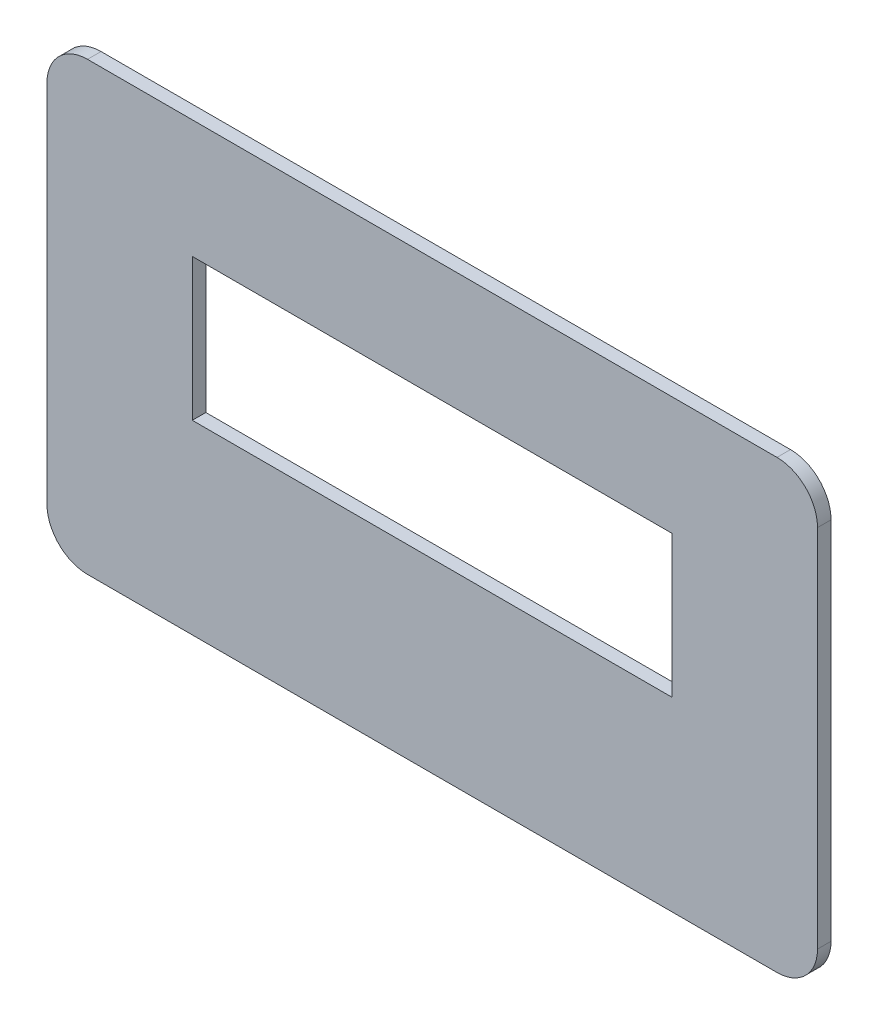
ISO-10303-21;
HEADER;
FILE_DESCRIPTION(('STEP AP214'),'2;1');
FILE_NAME('part.step','',(''),(''),'','','');
FILE_SCHEMA(('AUTOMOTIVE_DESIGN { 1 0 10303 214 1 1 1 1 }'));
ENDSEC;
DATA;
#1=APPLICATION_CONTEXT('core data for automotive mechanical design processes');
#2=APPLICATION_PROTOCOL_DEFINITION('international standard','automotive_design',2000,#1);
#3=PRODUCT_CONTEXT('',#1,'mechanical');
#4=PRODUCT('Part','Part','',(#3));
#5=PRODUCT_RELATED_PRODUCT_CATEGORY('part','',(#4));
#6=PRODUCT_DEFINITION_FORMATION('','',#4);
#7=PRODUCT_DEFINITION_CONTEXT('part definition',#1,'design');
#8=PRODUCT_DEFINITION('design','',#6,#7);
#9=PRODUCT_DEFINITION_SHAPE('','',#8);
#10=(LENGTH_UNIT() NAMED_UNIT(*) SI_UNIT(.MILLI.,.METRE.));
#11=(NAMED_UNIT(*) PLANE_ANGLE_UNIT() SI_UNIT($,.RADIAN.));
#12=(NAMED_UNIT(*) SI_UNIT($,.STERADIAN.) SOLID_ANGLE_UNIT());
#13=UNCERTAINTY_MEASURE_WITH_UNIT(LENGTH_MEASURE(1.E-05),#10,'distance_accuracy_value','');
#14=(GEOMETRIC_REPRESENTATION_CONTEXT(3) GLOBAL_UNCERTAINTY_ASSIGNED_CONTEXT((#13)) GLOBAL_UNIT_ASSIGNED_CONTEXT((#10,
#11,#12)) REPRESENTATION_CONTEXT('',''));
#15=CARTESIAN_POINT('',(0.,0.,0.));
#16=DIRECTION('',(0.,0.,1.));
#17=DIRECTION('',(1.,0.,0.));
#18=AXIS2_PLACEMENT_3D('',#15,#16,#17);
#19=CARTESIAN_POINT('',(-51.,-27.,2.));
#20=DIRECTION('',(0.,0.,-1.));
#21=DIRECTION('',(-1.,0.,0.));
#22=AXIS2_PLACEMENT_3D('',#19,#20,#21);
#23=PLANE('',#22);
#24=CARTESIAN_POINT('',(-51.,-27.,2.));
#25=DIRECTION('',(0.,0.,1.));
#26=DIRECTION('',(-1.,0.,0.));
#27=AXIS2_PLACEMENT_3D('',#24,#25,#26);
#28=CIRCLE('',#27,5.99999999999999);
#29=CARTESIAN_POINT('',(-57.,-27.,2.));
#30=VERTEX_POINT('',#29);
#31=CARTESIAN_POINT('',(-51.,-33.,2.));
#32=VERTEX_POINT('',#31);
#33=EDGE_CURVE('E158',#30,#32,#28,.T.);
#34=ORIENTED_EDGE('',*,*,#33,.T.);
#35=DIRECTION('',(1.,0.,0.));
#36=VECTOR('',#35,1.);
#37=CARTESIAN_POINT('',(51.,-33.,2.));
#38=LINE('',#37,#36);
#39=CARTESIAN_POINT('',(51.,-33.,2.));
#40=VERTEX_POINT('',#39);
#41=EDGE_CURVE('E161',#32,#40,#38,.T.);
#42=ORIENTED_EDGE('',*,*,#41,.T.);
#43=CARTESIAN_POINT('',(51.,-27.,2.));
#44=DIRECTION('',(0.,0.,1.));
#45=DIRECTION('',(1.,0.,0.));
#46=AXIS2_PLACEMENT_3D('',#43,#44,#45);
#47=CIRCLE('',#46,6.);
#48=CARTESIAN_POINT('',(57.,-27.,2.));
#49=VERTEX_POINT('',#48);
#50=EDGE_CURVE('E164',#40,#49,#47,.T.);
#51=ORIENTED_EDGE('',*,*,#50,.T.);
#52=DIRECTION('',(0.,1.,0.));
#53=VECTOR('',#52,1.);
#54=CARTESIAN_POINT('',(57.,27.,2.));
#55=LINE('',#54,#53);
#56=CARTESIAN_POINT('',(57.,27.,2.));
#57=VERTEX_POINT('',#56);
#58=EDGE_CURVE('E166',#49,#57,#55,.T.);
#59=ORIENTED_EDGE('',*,*,#58,.T.);
#60=CARTESIAN_POINT('',(51.,27.,2.));
#61=DIRECTION('',(0.,0.,1.));
#62=DIRECTION('',(1.,0.,0.));
#63=AXIS2_PLACEMENT_3D('',#60,#61,#62);
#64=CIRCLE('',#63,6.);
#65=CARTESIAN_POINT('',(51.,33.,2.));
#66=VERTEX_POINT('',#65);
#67=EDGE_CURVE('E168',#57,#66,#64,.T.);
#68=ORIENTED_EDGE('',*,*,#67,.T.);
#69=DIRECTION('',(-1.,0.,0.));
#70=VECTOR('',#69,1.);
#71=CARTESIAN_POINT('',(51.,33.,2.));
#72=LINE('',#71,#70);
#73=CARTESIAN_POINT('',(-51.,33.,2.));
#74=VERTEX_POINT('',#73);
#75=EDGE_CURVE('E170',#66,#74,#72,.T.);
#76=ORIENTED_EDGE('',*,*,#75,.T.);
#77=CARTESIAN_POINT('',(-51.,27.,2.));
#78=DIRECTION('',(0.,0.,1.));
#79=DIRECTION('',(-1.,0.,0.));
#80=AXIS2_PLACEMENT_3D('',#77,#78,#79);
#81=CIRCLE('',#80,5.99999999999999);
#82=CARTESIAN_POINT('',(-57.,27.,2.));
#83=VERTEX_POINT('',#82);
#84=EDGE_CURVE('E172',#74,#83,#81,.T.);
#85=ORIENTED_EDGE('',*,*,#84,.T.);
#86=DIRECTION('',(0.,-1.,0.));
#87=VECTOR('',#86,1.);
#88=CARTESIAN_POINT('',(-57.,27.,2.));
#89=LINE('',#88,#87);
#90=EDGE_CURVE('E174',#83,#30,#89,.T.);
#91=ORIENTED_EDGE('',*,*,#90,.T.);
#92=EDGE_LOOP('',(#34,#42,#51,#59,#68,#76,#85,#91));
#93=FACE_BOUND('',#92,.T.);
#94=DIRECTION('',(0.,1.,0.));
#95=VECTOR('',#94,1.);
#96=CARTESIAN_POINT('',(35.5,-5.5,2.));
#97=LINE('',#96,#95);
#98=CARTESIAN_POINT('',(35.5,-5.5,2.));
#99=VERTEX_POINT('',#98);
#100=CARTESIAN_POINT('',(35.5,15.5,2.));
#101=VERTEX_POINT('',#100);
#102=EDGE_CURVE('E122',#99,#101,#97,.T.);
#103=ORIENTED_EDGE('',*,*,#102,.F.);
#104=DIRECTION('',(1.,0.,0.));
#105=VECTOR('',#104,1.);
#106=CARTESIAN_POINT('',(-35.5,-5.5,2.));
#107=LINE('',#106,#105);
#108=CARTESIAN_POINT('',(-35.5,-5.5,2.));
#109=VERTEX_POINT('',#108);
#110=EDGE_CURVE('E144',#109,#99,#107,.T.);
#111=ORIENTED_EDGE('',*,*,#110,.F.);
#112=DIRECTION('',(0.,-1.,0.));
#113=VECTOR('',#112,1.);
#114=CARTESIAN_POINT('',(-35.5,-5.5,2.));
#115=LINE('',#114,#113);
#116=CARTESIAN_POINT('',(-35.5,15.5,2.));
#117=VERTEX_POINT('',#116);
#118=EDGE_CURVE('E142',#117,#109,#115,.T.);
#119=ORIENTED_EDGE('',*,*,#118,.F.);
#120=DIRECTION('',(-1.,0.,0.));
#121=VECTOR('',#120,1.);
#122=CARTESIAN_POINT('',(-35.5,15.5,2.));
#123=LINE('',#122,#121);
#124=EDGE_CURVE('E130',#101,#117,#123,.T.);
#125=ORIENTED_EDGE('',*,*,#124,.F.);
#126=EDGE_LOOP('',(#103,#111,#119,#125));
#127=FACE_BOUND('',#126,.T.);
#128=ADVANCED_FACE('F33',(#93,#127),#23,.F.);
#129=CARTESIAN_POINT('',(-51.,-27.,0.));
#130=DIRECTION('',(0.,0.,-1.));
#131=DIRECTION('',(-1.,0.,0.));
#132=AXIS2_PLACEMENT_3D('',#129,#130,#131);
#133=PLANE('',#132);
#134=CARTESIAN_POINT('',(-51.,-27.,0.));
#135=DIRECTION('',(0.,0.,1.));
#136=DIRECTION('',(-1.,0.,0.));
#137=AXIS2_PLACEMENT_3D('',#134,#135,#136);
#138=CIRCLE('',#137,5.99999999999999);
#139=CARTESIAN_POINT('',(-57.,-27.,0.));
#140=VERTEX_POINT('',#139);
#141=CARTESIAN_POINT('',(-51.,-33.,0.));
#142=VERTEX_POINT('',#141);
#143=EDGE_CURVE('E138',#140,#142,#138,.T.);
#144=ORIENTED_EDGE('',*,*,#143,.F.);
#145=DIRECTION('',(0.,-1.,0.));
#146=VECTOR('',#145,1.);
#147=CARTESIAN_POINT('',(-57.,27.,0.));
#148=LINE('',#147,#146);
#149=CARTESIAN_POINT('',(-57.,27.,0.));
#150=VERTEX_POINT('',#149);
#151=EDGE_CURVE('E162',#150,#140,#148,.T.);
#152=ORIENTED_EDGE('',*,*,#151,.F.);
#153=CARTESIAN_POINT('',(-51.,27.,0.));
#154=DIRECTION('',(0.,0.,1.));
#155=DIRECTION('',(-1.,0.,0.));
#156=AXIS2_PLACEMENT_3D('',#153,#154,#155);
#157=CIRCLE('',#156,5.99999999999999);
#158=CARTESIAN_POINT('',(-51.,33.,0.));
#159=VERTEX_POINT('',#158);
#160=EDGE_CURVE('E189',#159,#150,#157,.T.);
#161=ORIENTED_EDGE('',*,*,#160,.F.);
#162=DIRECTION('',(-1.,0.,0.));
#163=VECTOR('',#162,1.);
#164=CARTESIAN_POINT('',(51.,33.,0.));
#165=LINE('',#164,#163);
#166=CARTESIAN_POINT('',(51.,33.,0.));
#167=VERTEX_POINT('',#166);
#168=EDGE_CURVE('E187',#167,#159,#165,.T.);
#169=ORIENTED_EDGE('',*,*,#168,.F.);
#170=CARTESIAN_POINT('',(51.,27.,0.));
#171=DIRECTION('',(0.,0.,1.));
#172=DIRECTION('',(1.,0.,0.));
#173=AXIS2_PLACEMENT_3D('',#170,#171,#172);
#174=CIRCLE('',#173,6.);
#175=CARTESIAN_POINT('',(57.,27.,0.));
#176=VERTEX_POINT('',#175);
#177=EDGE_CURVE('E185',#176,#167,#174,.T.);
#178=ORIENTED_EDGE('',*,*,#177,.F.);
#179=DIRECTION('',(0.,1.,0.));
#180=VECTOR('',#179,1.);
#181=CARTESIAN_POINT('',(57.,27.,0.));
#182=LINE('',#181,#180);
#183=CARTESIAN_POINT('',(57.,-27.,0.));
#184=VERTEX_POINT('',#183);
#185=EDGE_CURVE('E183',#184,#176,#182,.T.);
#186=ORIENTED_EDGE('',*,*,#185,.F.);
#187=CARTESIAN_POINT('',(51.,-27.,0.));
#188=DIRECTION('',(0.,0.,1.));
#189=DIRECTION('',(1.,0.,0.));
#190=AXIS2_PLACEMENT_3D('',#187,#188,#189);
#191=CIRCLE('',#190,6.);
#192=CARTESIAN_POINT('',(51.,-33.,0.));
#193=VERTEX_POINT('',#192);
#194=EDGE_CURVE('E181',#193,#184,#191,.T.);
#195=ORIENTED_EDGE('',*,*,#194,.F.);
#196=DIRECTION('',(1.,0.,0.));
#197=VECTOR('',#196,1.);
#198=CARTESIAN_POINT('',(51.,-33.,0.));
#199=LINE('',#198,#197);
#200=EDGE_CURVE('E179',#142,#193,#199,.T.);
#201=ORIENTED_EDGE('',*,*,#200,.F.);
#202=EDGE_LOOP('',(#144,#152,#161,#169,#178,#186,#195,#201));
#203=FACE_BOUND('',#202,.T.);
#204=DIRECTION('',(1.,0.,0.));
#205=VECTOR('',#204,1.);
#206=CARTESIAN_POINT('',(-35.5,-5.5,0.));
#207=LINE('',#206,#205);
#208=CARTESIAN_POINT('',(-35.5,-5.5,0.));
#209=VERTEX_POINT('',#208);
#210=CARTESIAN_POINT('',(35.5,-5.5,0.));
#211=VERTEX_POINT('',#210);
#212=EDGE_CURVE('E131',#209,#211,#207,.T.);
#213=ORIENTED_EDGE('',*,*,#212,.T.);
#214=DIRECTION('',(0.,1.,0.));
#215=VECTOR('',#214,1.);
#216=CARTESIAN_POINT('',(35.5,-5.5,0.));
#217=LINE('',#216,#215);
#218=CARTESIAN_POINT('',(35.5,15.5,0.));
#219=VERTEX_POINT('',#218);
#220=EDGE_CURVE('E56',#211,#219,#217,.T.);
#221=ORIENTED_EDGE('',*,*,#220,.T.);
#222=DIRECTION('',(-1.,0.,0.));
#223=VECTOR('',#222,1.);
#224=CARTESIAN_POINT('',(-35.5,15.5,0.));
#225=LINE('',#224,#223);
#226=CARTESIAN_POINT('',(-35.5,15.5,0.));
#227=VERTEX_POINT('',#226);
#228=EDGE_CURVE('E137',#219,#227,#225,.T.);
#229=ORIENTED_EDGE('',*,*,#228,.T.);
#230=DIRECTION('',(0.,-1.,0.));
#231=VECTOR('',#230,1.);
#232=CARTESIAN_POINT('',(-35.5,-5.5,0.));
#233=LINE('',#232,#231);
#234=EDGE_CURVE('E150',#227,#209,#233,.T.);
#235=ORIENTED_EDGE('',*,*,#234,.T.);
#236=EDGE_LOOP('',(#213,#221,#229,#235));
#237=FACE_BOUND('',#236,.T.);
#238=ADVANCED_FACE('F219',(#203,#237),#133,.T.);
#239=CARTESIAN_POINT('',(-51.,-27.,2.));
#240=DIRECTION('',(0.,0.,-1.));
#241=DIRECTION('',(-1.,0.,0.));
#242=AXIS2_PLACEMENT_3D('',#239,#240,#241);
#243=CYLINDRICAL_SURFACE('',#242,5.99999999999999);
#244=ORIENTED_EDGE('',*,*,#143,.T.);
#245=DIRECTION('',(0.,0.,-1.));
#246=VECTOR('',#245,1.);
#247=CARTESIAN_POINT('',(-51.,-33.,2.));
#248=LINE('',#247,#246);
#249=EDGE_CURVE('E11',#32,#142,#248,.T.);
#250=ORIENTED_EDGE('',*,*,#249,.F.);
#251=ORIENTED_EDGE('',*,*,#33,.F.);
#252=DIRECTION('',(0.,0.,-1.));
#253=VECTOR('',#252,1.);
#254=CARTESIAN_POINT('',(-57.,-27.,2.));
#255=LINE('',#254,#253);
#256=EDGE_CURVE('E176',#30,#140,#255,.T.);
#257=ORIENTED_EDGE('',*,*,#256,.T.);
#258=EDGE_LOOP('',(#244,#250,#251,#257));
#259=FACE_BOUND('',#258,.T.);
#260=ADVANCED_FACE('F35',(#259),#243,.T.);
#261=CARTESIAN_POINT('',(51.,-33.,2.));
#262=DIRECTION('',(0.,1.,0.));
#263=DIRECTION('',(-1.,0.,0.));
#264=AXIS2_PLACEMENT_3D('',#261,#262,#263);
#265=PLANE('',#264);
#266=ORIENTED_EDGE('',*,*,#200,.T.);
#267=DIRECTION('',(0.,0.,-1.));
#268=VECTOR('',#267,1.);
#269=CARTESIAN_POINT('',(51.,-33.,2.));
#270=LINE('',#269,#268);
#271=EDGE_CURVE('E41',#40,#193,#270,.T.);
#272=ORIENTED_EDGE('',*,*,#271,.F.);
#273=ORIENTED_EDGE('',*,*,#41,.F.);
#274=ORIENTED_EDGE('',*,*,#249,.T.);
#275=EDGE_LOOP('',(#266,#272,#273,#274));
#276=FACE_BOUND('',#275,.T.);
#277=ADVANCED_FACE('F236',(#276),#265,.F.);
#278=CARTESIAN_POINT('',(51.,-27.,2.));
#279=DIRECTION('',(0.,0.,-1.));
#280=DIRECTION('',(-1.,0.,0.));
#281=AXIS2_PLACEMENT_3D('',#278,#279,#280);
#282=CYLINDRICAL_SURFACE('',#281,6.);
#283=ORIENTED_EDGE('',*,*,#194,.T.);
#284=DIRECTION('',(0.,0.,-1.));
#285=VECTOR('',#284,1.);
#286=CARTESIAN_POINT('',(57.,-27.,2.));
#287=LINE('',#286,#285);
#288=EDGE_CURVE('E206',#49,#184,#287,.T.);
#289=ORIENTED_EDGE('',*,*,#288,.F.);
#290=ORIENTED_EDGE('',*,*,#50,.F.);
#291=ORIENTED_EDGE('',*,*,#271,.T.);
#292=EDGE_LOOP('',(#283,#289,#290,#291));
#293=FACE_BOUND('',#292,.T.);
#294=ADVANCED_FACE('F213',(#293),#282,.T.);
#295=CARTESIAN_POINT('',(57.,27.,2.));
#296=DIRECTION('',(-1.,0.,0.));
#297=DIRECTION('',(0.,-1.,0.));
#298=AXIS2_PLACEMENT_3D('',#295,#296,#297);
#299=PLANE('',#298);
#300=ORIENTED_EDGE('',*,*,#185,.T.);
#301=DIRECTION('',(0.,0.,-1.));
#302=VECTOR('',#301,1.);
#303=CARTESIAN_POINT('',(57.,27.,2.));
#304=LINE('',#303,#302);
#305=EDGE_CURVE('E203',#57,#176,#304,.T.);
#306=ORIENTED_EDGE('',*,*,#305,.F.);
#307=ORIENTED_EDGE('',*,*,#58,.F.);
#308=ORIENTED_EDGE('',*,*,#288,.T.);
#309=EDGE_LOOP('',(#300,#306,#307,#308));
#310=FACE_BOUND('',#309,.T.);
#311=ADVANCED_FACE('F225',(#310),#299,.F.);
#312=CARTESIAN_POINT('',(51.,27.,2.));
#313=DIRECTION('',(0.,0.,-1.));
#314=DIRECTION('',(-1.,0.,0.));
#315=AXIS2_PLACEMENT_3D('',#312,#313,#314);
#316=CYLINDRICAL_SURFACE('',#315,6.);
#317=ORIENTED_EDGE('',*,*,#177,.T.);
#318=DIRECTION('',(0.,0.,-1.));
#319=VECTOR('',#318,1.);
#320=CARTESIAN_POINT('',(51.,33.,2.));
#321=LINE('',#320,#319);
#322=EDGE_CURVE('E200',#66,#167,#321,.T.);
#323=ORIENTED_EDGE('',*,*,#322,.F.);
#324=ORIENTED_EDGE('',*,*,#67,.F.);
#325=ORIENTED_EDGE('',*,*,#305,.T.);
#326=EDGE_LOOP('',(#317,#323,#324,#325));
#327=FACE_BOUND('',#326,.T.);
#328=ADVANCED_FACE('F229',(#327),#316,.T.);
#329=CARTESIAN_POINT('',(51.,33.,2.));
#330=DIRECTION('',(0.,-1.,0.));
#331=DIRECTION('',(1.,0.,0.));
#332=AXIS2_PLACEMENT_3D('',#329,#330,#331);
#333=PLANE('',#332);
#334=ORIENTED_EDGE('',*,*,#168,.T.);
#335=DIRECTION('',(0.,0.,-1.));
#336=VECTOR('',#335,1.);
#337=CARTESIAN_POINT('',(-51.,33.,2.));
#338=LINE('',#337,#336);
#339=EDGE_CURVE('E197',#74,#159,#338,.T.);
#340=ORIENTED_EDGE('',*,*,#339,.F.);
#341=ORIENTED_EDGE('',*,*,#75,.F.);
#342=ORIENTED_EDGE('',*,*,#322,.T.);
#343=EDGE_LOOP('',(#334,#340,#341,#342));
#344=FACE_BOUND('',#343,.T.);
#345=ADVANCED_FACE('F249',(#344),#333,.F.);
#346=CARTESIAN_POINT('',(-51.,27.,2.));
#347=DIRECTION('',(0.,0.,-1.));
#348=DIRECTION('',(-1.,0.,0.));
#349=AXIS2_PLACEMENT_3D('',#346,#347,#348);
#350=CYLINDRICAL_SURFACE('',#349,5.99999999999999);
#351=ORIENTED_EDGE('',*,*,#160,.T.);
#352=DIRECTION('',(0.,0.,-1.));
#353=VECTOR('',#352,1.);
#354=CARTESIAN_POINT('',(-57.,27.,2.));
#355=LINE('',#354,#353);
#356=EDGE_CURVE('E194',#83,#150,#355,.T.);
#357=ORIENTED_EDGE('',*,*,#356,.F.);
#358=ORIENTED_EDGE('',*,*,#84,.F.);
#359=ORIENTED_EDGE('',*,*,#339,.T.);
#360=EDGE_LOOP('',(#351,#357,#358,#359));
#361=FACE_BOUND('',#360,.T.);
#362=ADVANCED_FACE('F247',(#361),#350,.T.);
#363=CARTESIAN_POINT('',(-57.,27.,2.));
#364=DIRECTION('',(1.,0.,0.));
#365=DIRECTION('',(0.,1.,0.));
#366=AXIS2_PLACEMENT_3D('',#363,#364,#365);
#367=PLANE('',#366);
#368=ORIENTED_EDGE('',*,*,#151,.T.);
#369=ORIENTED_EDGE('',*,*,#256,.F.);
#370=ORIENTED_EDGE('',*,*,#90,.F.);
#371=ORIENTED_EDGE('',*,*,#356,.T.);
#372=EDGE_LOOP('',(#368,#369,#370,#371));
#373=FACE_BOUND('',#372,.T.);
#374=ADVANCED_FACE('F242',(#373),#367,.F.);
#375=CARTESIAN_POINT('',(35.5,-5.5,2.));
#376=DIRECTION('',(-1.,0.,0.));
#377=DIRECTION('',(0.,-1.,0.));
#378=AXIS2_PLACEMENT_3D('',#375,#376,#377);
#379=PLANE('',#378);
#380=ORIENTED_EDGE('',*,*,#220,.F.);
#381=DIRECTION('',(0.,0.,-1.));
#382=VECTOR('',#381,1.);
#383=CARTESIAN_POINT('',(35.5,-5.5,2.));
#384=LINE('',#383,#382);
#385=EDGE_CURVE('E126',#99,#211,#384,.T.);
#386=ORIENTED_EDGE('',*,*,#385,.F.);
#387=ORIENTED_EDGE('',*,*,#102,.T.);
#388=DIRECTION('',(0.,0.,-1.));
#389=VECTOR('',#388,1.);
#390=CARTESIAN_POINT('',(35.5,15.5,2.));
#391=LINE('',#390,#389);
#392=EDGE_CURVE('E125',#101,#219,#391,.T.);
#393=ORIENTED_EDGE('',*,*,#392,.T.);
#394=EDGE_LOOP('',(#380,#386,#387,#393));
#395=FACE_BOUND('',#394,.T.);
#396=ADVANCED_FACE('F124',(#395),#379,.T.);
#397=CARTESIAN_POINT('',(-35.5,15.5,2.));
#398=DIRECTION('',(0.,-1.,0.));
#399=DIRECTION('',(0.,0.,-1.));
#400=AXIS2_PLACEMENT_3D('',#397,#398,#399);
#401=PLANE('',#400);
#402=ORIENTED_EDGE('',*,*,#228,.F.);
#403=ORIENTED_EDGE('',*,*,#392,.F.);
#404=ORIENTED_EDGE('',*,*,#124,.T.);
#405=DIRECTION('',(0.,0.,-1.));
#406=VECTOR('',#405,1.);
#407=CARTESIAN_POINT('',(-35.5,15.5,2.));
#408=LINE('',#407,#406);
#409=EDGE_CURVE('E139',#117,#227,#408,.T.);
#410=ORIENTED_EDGE('',*,*,#409,.T.);
#411=EDGE_LOOP('',(#402,#403,#404,#410));
#412=FACE_BOUND('',#411,.T.);
#413=ADVANCED_FACE('F134',(#412),#401,.T.);
#414=CARTESIAN_POINT('',(-35.5,-5.5,2.));
#415=DIRECTION('',(1.,0.,0.));
#416=DIRECTION('',(0.,0.,-1.));
#417=AXIS2_PLACEMENT_3D('',#414,#415,#416);
#418=PLANE('',#417);
#419=ORIENTED_EDGE('',*,*,#234,.F.);
#420=ORIENTED_EDGE('',*,*,#409,.F.);
#421=ORIENTED_EDGE('',*,*,#118,.T.);
#422=DIRECTION('',(0.,0.,-1.));
#423=VECTOR('',#422,1.);
#424=CARTESIAN_POINT('',(-35.5,-5.5,2.));
#425=LINE('',#424,#423);
#426=EDGE_CURVE('E48',#109,#209,#425,.T.);
#427=ORIENTED_EDGE('',*,*,#426,.T.);
#428=EDGE_LOOP('',(#419,#420,#421,#427));
#429=FACE_BOUND('',#428,.T.);
#430=ADVANCED_FACE('F274',(#429),#418,.T.);
#431=CARTESIAN_POINT('',(-35.5,-5.5,2.));
#432=DIRECTION('',(0.,1.,0.));
#433=DIRECTION('',(0.,0.,1.));
#434=AXIS2_PLACEMENT_3D('',#431,#432,#433);
#435=PLANE('',#434);
#436=ORIENTED_EDGE('',*,*,#212,.F.);
#437=ORIENTED_EDGE('',*,*,#426,.F.);
#438=ORIENTED_EDGE('',*,*,#110,.T.);
#439=ORIENTED_EDGE('',*,*,#385,.T.);
#440=EDGE_LOOP('',(#436,#437,#438,#439));
#441=FACE_BOUND('',#440,.T.);
#442=ADVANCED_FACE('F278',(#441),#435,.T.);
#443=CLOSED_SHELL('',(#128,#238,#260,#277,#294,#311,#328,#345,#362,#374,#396,#413,#430,#442));
#444=MANIFOLD_SOLID_BREP('B2',#443);
#445=ADVANCED_BREP_SHAPE_REPRESENTATION('',(#18,#444),#14);
#446=SHAPE_DEFINITION_REPRESENTATION(#9,#445);
ENDSEC;
END-ISO-10303-21;
